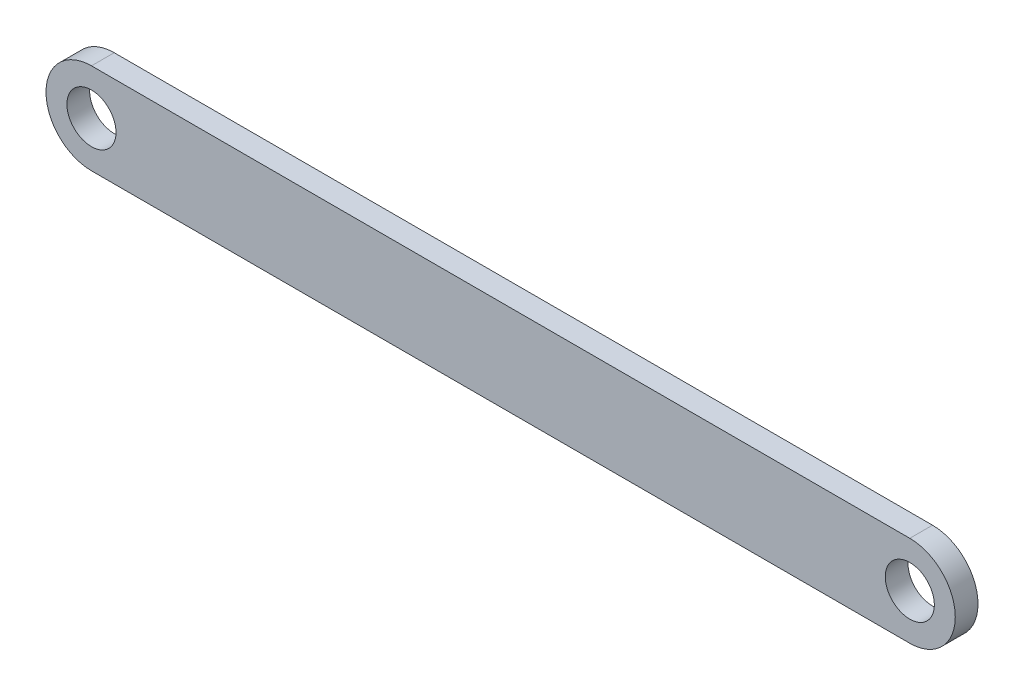
ISO-10303-21;
HEADER;
FILE_DESCRIPTION(('STEP AP214'),'2;1');
FILE_NAME('part.step','',(''),(''),'','','');
FILE_SCHEMA(('AUTOMOTIVE_DESIGN { 1 0 10303 214 1 1 1 1 }'));
ENDSEC;
DATA;
#1=APPLICATION_CONTEXT('core data for automotive mechanical design processes');
#2=APPLICATION_PROTOCOL_DEFINITION('international standard','automotive_design',2000,#1);
#3=PRODUCT_CONTEXT('',#1,'mechanical');
#4=PRODUCT('Part','Part','',(#3));
#5=PRODUCT_RELATED_PRODUCT_CATEGORY('part','',(#4));
#6=PRODUCT_DEFINITION_FORMATION('','',#4);
#7=PRODUCT_DEFINITION_CONTEXT('part definition',#1,'design');
#8=PRODUCT_DEFINITION('design','',#6,#7);
#9=PRODUCT_DEFINITION_SHAPE('','',#8);
#10=(LENGTH_UNIT() NAMED_UNIT(*) SI_UNIT(.MILLI.,.METRE.));
#11=(NAMED_UNIT(*) PLANE_ANGLE_UNIT() SI_UNIT($,.RADIAN.));
#12=(NAMED_UNIT(*) SI_UNIT($,.STERADIAN.) SOLID_ANGLE_UNIT());
#13=UNCERTAINTY_MEASURE_WITH_UNIT(LENGTH_MEASURE(1.E-05),#10,'distance_accuracy_value','');
#14=(GEOMETRIC_REPRESENTATION_CONTEXT(3) GLOBAL_UNCERTAINTY_ASSIGNED_CONTEXT((#13)) GLOBAL_UNIT_ASSIGNED_CONTEXT((#10,
#11,#12)) REPRESENTATION_CONTEXT('',''));
#15=CARTESIAN_POINT('',(0.,0.,0.));
#16=DIRECTION('',(0.,0.,1.));
#17=DIRECTION('',(1.,0.,0.));
#18=AXIS2_PLACEMENT_3D('',#15,#16,#17);
#19=CARTESIAN_POINT('',(10.,10.,0.));
#20=DIRECTION('',(0.,0.,-1.));
#21=DIRECTION('',(-1.,0.,0.));
#22=AXIS2_PLACEMENT_3D('',#19,#20,#21);
#23=CYLINDRICAL_SURFACE('',#22,10.);
#24=DIRECTION('',(0.,0.,-1.));
#25=VECTOR('',#24,1.);
#26=CARTESIAN_POINT('',(10.,20.,5.));
#27=LINE('',#26,#25);
#28=CARTESIAN_POINT('',(10.,20.,0.));
#29=VERTEX_POINT('',#28);
#30=CARTESIAN_POINT('',(10.,20.,5.));
#31=VERTEX_POINT('',#30);
#32=EDGE_CURVE('E95',#29,#31,#27,.F.);
#33=ORIENTED_EDGE('',*,*,#32,.F.);
#34=CARTESIAN_POINT('',(10.,10.,0.));
#35=DIRECTION('',(0.,0.,-1.));
#36=DIRECTION('',(-1.,0.,0.));
#37=AXIS2_PLACEMENT_3D('',#34,#35,#36);
#38=CIRCLE('',#37,10.);
#39=CARTESIAN_POINT('',(10.,0.,0.));
#40=VERTEX_POINT('',#39);
#41=EDGE_CURVE('E53',#40,#29,#38,.T.);
#42=ORIENTED_EDGE('',*,*,#41,.F.);
#43=DIRECTION('',(0.,0.,-1.));
#44=VECTOR('',#43,1.);
#45=CARTESIAN_POINT('',(10.,0.,5.));
#46=LINE('',#45,#44);
#47=CARTESIAN_POINT('',(10.,0.,5.));
#48=VERTEX_POINT('',#47);
#49=EDGE_CURVE('E116',#48,#40,#46,.T.);
#50=ORIENTED_EDGE('',*,*,#49,.F.);
#51=CARTESIAN_POINT('',(10.,10.,5.));
#52=DIRECTION('',(0.,0.,-1.));
#53=DIRECTION('',(-1.,0.,0.));
#54=AXIS2_PLACEMENT_3D('',#51,#52,#53);
#55=CIRCLE('',#54,10.);
#56=EDGE_CURVE('E12',#31,#48,#55,.F.);
#57=ORIENTED_EDGE('',*,*,#56,.F.);
#58=EDGE_LOOP('',(#33,#42,#50,#57));
#59=FACE_BOUND('',#58,.T.);
#60=ADVANCED_FACE('F45',(#59),#23,.T.);
#61=CARTESIAN_POINT('',(190.,10.,5.));
#62=DIRECTION('',(0.,0.,-1.));
#63=DIRECTION('',(-1.,0.,0.));
#64=AXIS2_PLACEMENT_3D('',#61,#62,#63);
#65=CYLINDRICAL_SURFACE('',#64,10.);
#66=DIRECTION('',(0.,0.,-1.));
#67=VECTOR('',#66,1.);
#68=CARTESIAN_POINT('',(190.,20.,5.));
#69=LINE('',#68,#67);
#70=CARTESIAN_POINT('',(190.,20.,5.));
#71=VERTEX_POINT('',#70);
#72=CARTESIAN_POINT('',(190.,20.,0.));
#73=VERTEX_POINT('',#72);
#74=EDGE_CURVE('E88',#71,#73,#69,.T.);
#75=ORIENTED_EDGE('',*,*,#74,.F.);
#76=CARTESIAN_POINT('',(190.,10.,5.));
#77=DIRECTION('',(0.,0.,-1.));
#78=DIRECTION('',(-1.,0.,0.));
#79=AXIS2_PLACEMENT_3D('',#76,#77,#78);
#80=CIRCLE('',#79,10.);
#81=CARTESIAN_POINT('',(190.,0.,5.));
#82=VERTEX_POINT('',#81);
#83=EDGE_CURVE('E96',#82,#71,#80,.F.);
#84=ORIENTED_EDGE('',*,*,#83,.F.);
#85=DIRECTION('',(0.,0.,-1.));
#86=VECTOR('',#85,1.);
#87=CARTESIAN_POINT('',(190.,0.,5.));
#88=LINE('',#87,#86);
#89=CARTESIAN_POINT('',(190.,0.,0.));
#90=VERTEX_POINT('',#89);
#91=EDGE_CURVE('E91',#90,#82,#88,.F.);
#92=ORIENTED_EDGE('',*,*,#91,.F.);
#93=CARTESIAN_POINT('',(190.,10.,0.));
#94=DIRECTION('',(0.,0.,-1.));
#95=DIRECTION('',(-1.,0.,0.));
#96=AXIS2_PLACEMENT_3D('',#93,#94,#95);
#97=CIRCLE('',#96,10.);
#98=EDGE_CURVE('E84',#73,#90,#97,.T.);
#99=ORIENTED_EDGE('',*,*,#98,.F.);
#100=EDGE_LOOP('',(#75,#84,#92,#99));
#101=FACE_BOUND('',#100,.T.);
#102=ADVANCED_FACE('F86',(#101),#65,.T.);
#103=CARTESIAN_POINT('',(0.,0.,5.));
#104=DIRECTION('',(0.,1.,0.));
#105=DIRECTION('',(0.,0.,1.));
#106=AXIS2_PLACEMENT_3D('',#103,#104,#105);
#107=PLANE('',#106);
#108=DIRECTION('',(1.,0.,0.));
#109=VECTOR('',#108,1.);
#110=CARTESIAN_POINT('',(0.,0.,5.));
#111=LINE('',#110,#109);
#112=EDGE_CURVE('E106',#48,#82,#111,.T.);
#113=ORIENTED_EDGE('',*,*,#112,.F.);
#114=ORIENTED_EDGE('',*,*,#49,.T.);
#115=DIRECTION('',(1.,0.,0.));
#116=VECTOR('',#115,1.);
#117=CARTESIAN_POINT('',(0.,0.,0.));
#118=LINE('',#117,#116);
#119=EDGE_CURVE('E107',#40,#90,#118,.T.);
#120=ORIENTED_EDGE('',*,*,#119,.T.);
#121=ORIENTED_EDGE('',*,*,#91,.T.);
#122=EDGE_LOOP('',(#113,#114,#120,#121));
#123=FACE_BOUND('',#122,.T.);
#124=ADVANCED_FACE('F119',(#123),#107,.F.);
#125=CARTESIAN_POINT('',(0.,20.,5.));
#126=DIRECTION('',(0.,-1.,0.));
#127=DIRECTION('',(0.,0.,-1.));
#128=AXIS2_PLACEMENT_3D('',#125,#126,#127);
#129=PLANE('',#128);
#130=DIRECTION('',(-1.,0.,0.));
#131=VECTOR('',#130,1.);
#132=CARTESIAN_POINT('',(0.,20.,0.));
#133=LINE('',#132,#131);
#134=EDGE_CURVE('E102',#73,#29,#133,.T.);
#135=ORIENTED_EDGE('',*,*,#134,.T.);
#136=ORIENTED_EDGE('',*,*,#32,.T.);
#137=DIRECTION('',(-1.,0.,0.));
#138=VECTOR('',#137,1.);
#139=CARTESIAN_POINT('',(0.,20.,5.));
#140=LINE('',#139,#138);
#141=EDGE_CURVE('E103',#71,#31,#140,.T.);
#142=ORIENTED_EDGE('',*,*,#141,.F.);
#143=ORIENTED_EDGE('',*,*,#74,.T.);
#144=EDGE_LOOP('',(#135,#136,#142,#143));
#145=FACE_BOUND('',#144,.T.);
#146=ADVANCED_FACE('F100',(#145),#129,.F.);
#147=CARTESIAN_POINT('',(0.,0.,5.));
#148=DIRECTION('',(0.,0.,-1.));
#149=DIRECTION('',(-1.,0.,0.));
#150=AXIS2_PLACEMENT_3D('',#147,#148,#149);
#151=PLANE('',#150);
#152=CARTESIAN_POINT('',(10.,10.,5.));
#153=DIRECTION('',(0.,0.,1.));
#154=DIRECTION('',(1.,0.,0.));
#155=AXIS2_PLACEMENT_3D('',#152,#153,#154);
#156=CIRCLE('',#155,5.4);
#157=CARTESIAN_POINT('',(15.4,10.,5.));
#158=VERTEX_POINT('',#157);
#159=EDGE_CURVE('E131',#158,#158,#156,.T.);
#160=ORIENTED_EDGE('',*,*,#159,.F.);
#161=EDGE_LOOP('',(#160));
#162=FACE_BOUND('',#161,.T.);
#163=CARTESIAN_POINT('',(190.,10.,5.));
#164=DIRECTION('',(0.,0.,1.));
#165=DIRECTION('',(1.,0.,0.));
#166=AXIS2_PLACEMENT_3D('',#163,#164,#165);
#167=CIRCLE('',#166,5.39999999999999);
#168=CARTESIAN_POINT('',(195.4,10.,5.));
#169=VERTEX_POINT('',#168);
#170=EDGE_CURVE('E128',#169,#169,#167,.T.);
#171=ORIENTED_EDGE('',*,*,#170,.F.);
#172=EDGE_LOOP('',(#171));
#173=FACE_BOUND('',#172,.T.);
#174=ORIENTED_EDGE('',*,*,#141,.T.);
#175=ORIENTED_EDGE('',*,*,#56,.T.);
#176=ORIENTED_EDGE('',*,*,#112,.T.);
#177=ORIENTED_EDGE('',*,*,#83,.T.);
#178=EDGE_LOOP('',(#174,#175,#176,#177));
#179=FACE_BOUND('',#178,.T.);
#180=ADVANCED_FACE('F120',(#162,#173,#179),#151,.F.);
#181=CARTESIAN_POINT('',(0.,0.,0.));
#182=DIRECTION('',(0.,0.,-1.));
#183=DIRECTION('',(-1.,0.,0.));
#184=AXIS2_PLACEMENT_3D('',#181,#182,#183);
#185=PLANE('',#184);
#186=CARTESIAN_POINT('',(10.,10.,0.));
#187=DIRECTION('',(0.,0.,1.));
#188=DIRECTION('',(1.,0.,0.));
#189=AXIS2_PLACEMENT_3D('',#186,#187,#188);
#190=CIRCLE('',#189,5.4);
#191=CARTESIAN_POINT('',(15.4,10.,0.));
#192=VERTEX_POINT('',#191);
#193=EDGE_CURVE('E109',#192,#192,#190,.T.);
#194=ORIENTED_EDGE('',*,*,#193,.T.);
#195=EDGE_LOOP('',(#194));
#196=FACE_BOUND('',#195,.T.);
#197=CARTESIAN_POINT('',(190.,10.,0.));
#198=DIRECTION('',(0.,0.,1.));
#199=DIRECTION('',(1.,0.,0.));
#200=AXIS2_PLACEMENT_3D('',#197,#198,#199);
#201=CIRCLE('',#200,5.39999999999999);
#202=CARTESIAN_POINT('',(195.4,10.,0.));
#203=VERTEX_POINT('',#202);
#204=EDGE_CURVE('E132',#203,#203,#201,.T.);
#205=ORIENTED_EDGE('',*,*,#204,.T.);
#206=EDGE_LOOP('',(#205));
#207=FACE_BOUND('',#206,.T.);
#208=ORIENTED_EDGE('',*,*,#119,.F.);
#209=ORIENTED_EDGE('',*,*,#41,.T.);
#210=ORIENTED_EDGE('',*,*,#134,.F.);
#211=ORIENTED_EDGE('',*,*,#98,.T.);
#212=EDGE_LOOP('',(#208,#209,#210,#211));
#213=FACE_BOUND('',#212,.T.);
#214=ADVANCED_FACE('F105',(#196,#207,#213),#185,.T.);
#215=CARTESIAN_POINT('',(190.,10.,0.));
#216=DIRECTION('',(0.,0.,1.));
#217=DIRECTION('',(1.,0.,0.));
#218=AXIS2_PLACEMENT_3D('',#215,#216,#217);
#219=CYLINDRICAL_SURFACE('',#218,5.39999999999999);
#220=ORIENTED_EDGE('',*,*,#204,.F.);
#221=EDGE_LOOP('',(#220));
#222=FACE_BOUND('',#221,.T.);
#223=ORIENTED_EDGE('',*,*,#170,.T.);
#224=EDGE_LOOP('',(#223));
#225=FACE_BOUND('',#224,.T.);
#226=ADVANCED_FACE('F139',(#222,#225),#219,.F.);
#227=CARTESIAN_POINT('',(10.,10.,0.));
#228=DIRECTION('',(0.,0.,1.));
#229=DIRECTION('',(1.,0.,0.));
#230=AXIS2_PLACEMENT_3D('',#227,#228,#229);
#231=CYLINDRICAL_SURFACE('',#230,5.4);
#232=ORIENTED_EDGE('',*,*,#193,.F.);
#233=EDGE_LOOP('',(#232));
#234=FACE_BOUND('',#233,.T.);
#235=ORIENTED_EDGE('',*,*,#159,.T.);
#236=EDGE_LOOP('',(#235));
#237=FACE_BOUND('',#236,.T.);
#238=ADVANCED_FACE('F142',(#234,#237),#231,.F.);
#239=CLOSED_SHELL('',(#60,#102,#124,#146,#180,#214,#226,#238));
#240=MANIFOLD_SOLID_BREP('B2',#239);
#241=ADVANCED_BREP_SHAPE_REPRESENTATION('',(#18,#240),#14);
#242=SHAPE_DEFINITION_REPRESENTATION(#9,#241);
ENDSEC;
END-ISO-10303-21;
